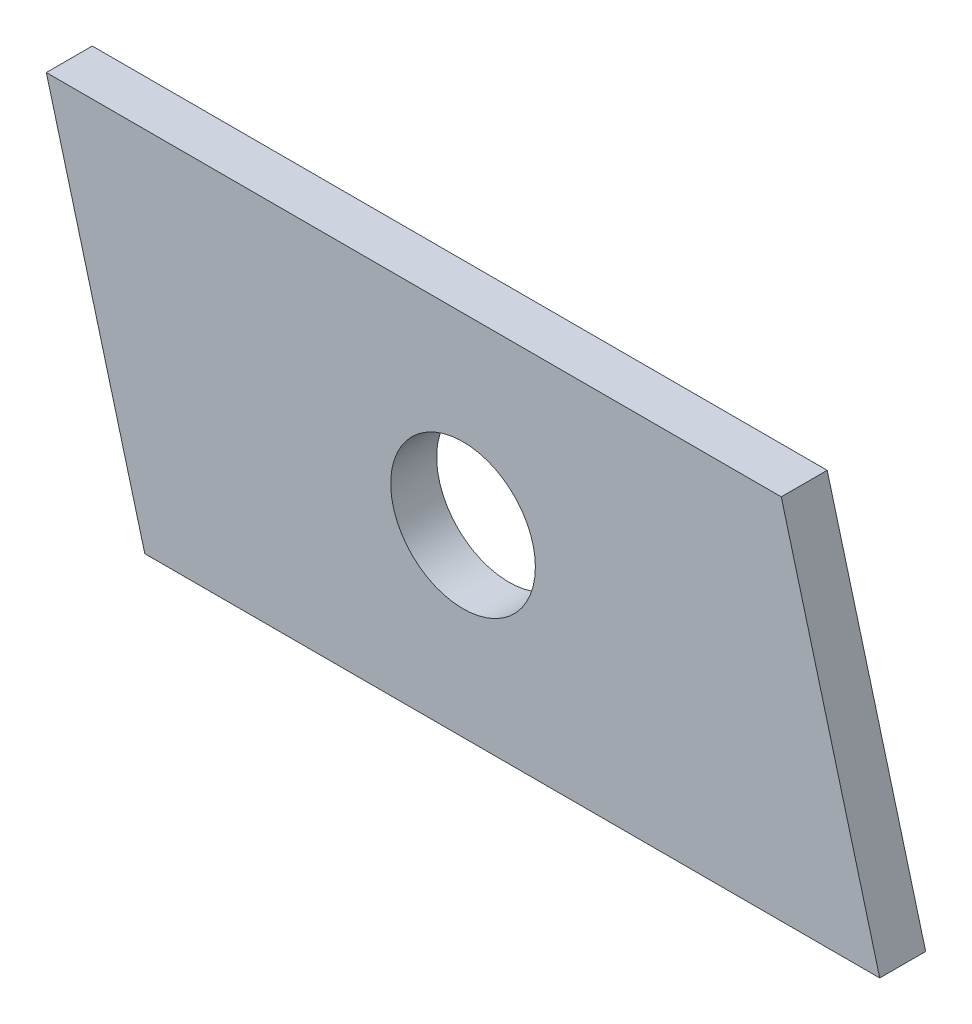
ISO-10303-21;
HEADER;
FILE_DESCRIPTION(('STEP AP214'),'2;1');
FILE_NAME('part.step','',(''),(''),'','','');
FILE_SCHEMA(('AUTOMOTIVE_DESIGN { 1 0 10303 214 1 1 1 1 }'));
ENDSEC;
DATA;
#1=APPLICATION_CONTEXT('core data for automotive mechanical design processes');
#2=APPLICATION_PROTOCOL_DEFINITION('international standard','automotive_design',2000,#1);
#3=PRODUCT_CONTEXT('',#1,'mechanical');
#4=PRODUCT('Part','Part','',(#3));
#5=PRODUCT_RELATED_PRODUCT_CATEGORY('part','',(#4));
#6=PRODUCT_DEFINITION_FORMATION('','',#4);
#7=PRODUCT_DEFINITION_CONTEXT('part definition',#1,'design');
#8=PRODUCT_DEFINITION('design','',#6,#7);
#9=PRODUCT_DEFINITION_SHAPE('','',#8);
#10=(LENGTH_UNIT() NAMED_UNIT(*) SI_UNIT(.MILLI.,.METRE.));
#11=(NAMED_UNIT(*) PLANE_ANGLE_UNIT() SI_UNIT($,.RADIAN.));
#12=(NAMED_UNIT(*) SI_UNIT($,.STERADIAN.) SOLID_ANGLE_UNIT());
#13=UNCERTAINTY_MEASURE_WITH_UNIT(LENGTH_MEASURE(1.E-05),#10,'distance_accuracy_value','');
#14=(GEOMETRIC_REPRESENTATION_CONTEXT(3) GLOBAL_UNCERTAINTY_ASSIGNED_CONTEXT((#13)) GLOBAL_UNIT_ASSIGNED_CONTEXT((#10,
#11,#12)) REPRESENTATION_CONTEXT('',''));
#15=CARTESIAN_POINT('',(0.,0.,0.));
#16=DIRECTION('',(0.,0.,1.));
#17=DIRECTION('',(1.,0.,0.));
#18=AXIS2_PLACEMENT_3D('',#15,#16,#17);
#19=CARTESIAN_POINT('',(-167.906905039941,117.173081746485,-3.175));
#20=DIRECTION('',(0.,1.,0.));
#21=DIRECTION('',(0.,0.,1.));
#22=AXIS2_PLACEMENT_3D('',#19,#20,#21);
#23=PLANE('',#22);
#24=DIRECTION('',(-1.,0.,0.));
#25=VECTOR('',#24,1.);
#26=CARTESIAN_POINT('',(-167.906905039941,117.173081746485,0.));
#27=LINE('',#26,#25);
#28=CARTESIAN_POINT('',(-167.906905039941,117.173081746485,0.));
#29=VERTEX_POINT('',#28);
#30=CARTESIAN_POINT('',(-218.706905039941,117.173081746485,0.));
#31=VERTEX_POINT('',#30);
#32=EDGE_CURVE('E117',#29,#31,#27,.T.);
#33=ORIENTED_EDGE('',*,*,#32,.F.);
#34=DIRECTION('',(0.,0.,1.));
#35=VECTOR('',#34,1.);
#36=CARTESIAN_POINT('',(-167.906905039941,117.173081746485,-3.175));
#37=LINE('',#36,#35);
#38=CARTESIAN_POINT('',(-167.906905039941,117.173081746485,-3.175));
#39=VERTEX_POINT('',#38);
#40=EDGE_CURVE('E11',#39,#29,#37,.T.);
#41=ORIENTED_EDGE('',*,*,#40,.F.);
#42=DIRECTION('',(-1.,0.,0.));
#43=VECTOR('',#42,1.);
#44=CARTESIAN_POINT('',(-167.906905039941,117.173081746485,-3.175));
#45=LINE('',#44,#43);
#46=CARTESIAN_POINT('',(-218.706905039941,117.173081746485,-3.175));
#47=VERTEX_POINT('',#46);
#48=EDGE_CURVE('E107',#39,#47,#45,.T.);
#49=ORIENTED_EDGE('',*,*,#48,.T.);
#50=DIRECTION('',(0.,0.,1.));
#51=VECTOR('',#50,1.);
#52=CARTESIAN_POINT('',(-218.706905039941,117.173081746485,-3.175));
#53=LINE('',#52,#51);
#54=EDGE_CURVE('E48',#47,#31,#53,.T.);
#55=ORIENTED_EDGE('',*,*,#54,.T.);
#56=EDGE_LOOP('',(#33,#41,#49,#55));
#57=FACE_BOUND('',#56,.T.);
#58=ADVANCED_FACE('F45',(#57),#23,.T.);
#59=CARTESIAN_POINT('',(-167.906905039941,117.173081746485,-3.175));
#60=DIRECTION('',(0.965925826289069,0.258819045102518,0.));
#61=DIRECTION('',(-0.258819045102518,0.965925826289069,0.));
#62=AXIS2_PLACEMENT_3D('',#59,#60,#61);
#63=PLANE('',#62);
#64=DIRECTION('',(-0.258819045102518,0.965925826289069,0.));
#65=VECTOR('',#64,1.);
#66=CARTESIAN_POINT('',(-167.906905039941,117.173081746485,0.));
#67=LINE('',#66,#65);
#68=CARTESIAN_POINT('',(-161.10099555219,91.7730817464852,0.));
#69=VERTEX_POINT('',#68);
#70=EDGE_CURVE('E111',#69,#29,#67,.T.);
#71=ORIENTED_EDGE('',*,*,#70,.F.);
#72=DIRECTION('',(0.,0.,1.));
#73=VECTOR('',#72,1.);
#74=CARTESIAN_POINT('',(-161.10099555219,91.7730817464852,-3.175));
#75=LINE('',#74,#73);
#76=CARTESIAN_POINT('',(-161.10099555219,91.7730817464852,-3.175));
#77=VERTEX_POINT('',#76);
#78=EDGE_CURVE('E55',#77,#69,#75,.T.);
#79=ORIENTED_EDGE('',*,*,#78,.F.);
#80=DIRECTION('',(-0.258819045102518,0.965925826289069,0.));
#81=VECTOR('',#80,1.);
#82=CARTESIAN_POINT('',(-167.906905039941,117.173081746485,-3.175));
#83=LINE('',#82,#81);
#84=EDGE_CURVE('E102',#77,#39,#83,.T.);
#85=ORIENTED_EDGE('',*,*,#84,.T.);
#86=ORIENTED_EDGE('',*,*,#40,.T.);
#87=EDGE_LOOP('',(#71,#79,#85,#86));
#88=FACE_BOUND('',#87,.T.);
#89=ADVANCED_FACE('F172',(#88),#63,.T.);
#90=CARTESIAN_POINT('',(-211.90099555219,91.7730817464852,-3.175));
#91=DIRECTION('',(0.,-1.,0.));
#92=DIRECTION('',(0.,0.,-1.));
#93=AXIS2_PLACEMENT_3D('',#90,#91,#92);
#94=PLANE('',#93);
#95=DIRECTION('',(1.,0.,0.));
#96=VECTOR('',#95,1.);
#97=CARTESIAN_POINT('',(-211.90099555219,91.7730817464852,0.));
#98=LINE('',#97,#96);
#99=CARTESIAN_POINT('',(-211.90099555219,91.7730817464852,0.));
#100=VERTEX_POINT('',#99);
#101=EDGE_CURVE('E96',#100,#69,#98,.T.);
#102=ORIENTED_EDGE('',*,*,#101,.F.);
#103=DIRECTION('',(0.,0.,1.));
#104=VECTOR('',#103,1.);
#105=CARTESIAN_POINT('',(-211.90099555219,91.7730817464852,-3.175));
#106=LINE('',#105,#104);
#107=CARTESIAN_POINT('',(-211.90099555219,91.7730817464852,-3.175));
#108=VERTEX_POINT('',#107);
#109=EDGE_CURVE('E91',#108,#100,#106,.T.);
#110=ORIENTED_EDGE('',*,*,#109,.F.);
#111=DIRECTION('',(1.,0.,0.));
#112=VECTOR('',#111,1.);
#113=CARTESIAN_POINT('',(-211.90099555219,91.7730817464852,-3.175));
#114=LINE('',#113,#112);
#115=EDGE_CURVE('E94',#108,#77,#114,.T.);
#116=ORIENTED_EDGE('',*,*,#115,.T.);
#117=ORIENTED_EDGE('',*,*,#78,.T.);
#118=EDGE_LOOP('',(#102,#110,#116,#117));
#119=FACE_BOUND('',#118,.T.);
#120=ADVANCED_FACE('F93',(#119),#94,.T.);
#121=CARTESIAN_POINT('',(-218.706905039941,117.173081746485,-3.175));
#122=DIRECTION('',(-0.965925826289069,-0.258819045102518,0.));
#123=DIRECTION('',(0.258819045102518,-0.965925826289069,0.));
#124=AXIS2_PLACEMENT_3D('',#121,#122,#123);
#125=PLANE('',#124);
#126=DIRECTION('',(0.258819045102518,-0.965925826289069,0.));
#127=VECTOR('',#126,1.);
#128=CARTESIAN_POINT('',(-218.706905039941,117.173081746485,0.));
#129=LINE('',#128,#127);
#130=EDGE_CURVE('E121',#31,#100,#129,.T.);
#131=ORIENTED_EDGE('',*,*,#130,.F.);
#132=ORIENTED_EDGE('',*,*,#54,.F.);
#133=DIRECTION('',(0.258819045102518,-0.965925826289069,0.));
#134=VECTOR('',#133,1.);
#135=CARTESIAN_POINT('',(-218.706905039941,117.173081746485,-3.175));
#136=LINE('',#135,#134);
#137=EDGE_CURVE('E101',#47,#108,#136,.T.);
#138=ORIENTED_EDGE('',*,*,#137,.T.);
#139=ORIENTED_EDGE('',*,*,#109,.T.);
#140=EDGE_LOOP('',(#131,#132,#138,#139));
#141=FACE_BOUND('',#140,.T.);
#142=ADVANCED_FACE('F105',(#141),#125,.T.);
#143=CARTESIAN_POINT('',(0.,0.,-3.175));
#144=DIRECTION('',(0.,0.,1.));
#145=DIRECTION('',(1.,0.,0.));
#146=AXIS2_PLACEMENT_3D('',#143,#144,#145);
#147=PLANE('',#146);
#148=CARTESIAN_POINT('',(-189.903950296066,104.473081746485,-3.175));
#149=DIRECTION('',(0.,0.,1.));
#150=DIRECTION('',(1.,0.,0.));
#151=AXIS2_PLACEMENT_3D('',#148,#149,#150);
#152=CIRCLE('',#151,4.99999999999999);
#153=CARTESIAN_POINT('',(-184.903950296066,104.473081746485,-3.175));
#154=VERTEX_POINT('',#153);
#155=EDGE_CURVE('E122',#154,#154,#152,.T.);
#156=ORIENTED_EDGE('',*,*,#155,.T.);
#157=EDGE_LOOP('',(#156));
#158=FACE_BOUND('',#157,.T.);
#159=ORIENTED_EDGE('',*,*,#48,.F.);
#160=ORIENTED_EDGE('',*,*,#84,.F.);
#161=ORIENTED_EDGE('',*,*,#115,.F.);
#162=ORIENTED_EDGE('',*,*,#137,.F.);
#163=EDGE_LOOP('',(#159,#160,#161,#162));
#164=FACE_BOUND('',#163,.T.);
#165=ADVANCED_FACE('F100',(#158,#164),#147,.F.);
#166=CARTESIAN_POINT('',(0.,0.,0.));
#167=DIRECTION('',(0.,0.,1.));
#168=DIRECTION('',(1.,0.,0.));
#169=AXIS2_PLACEMENT_3D('',#166,#167,#168);
#170=PLANE('',#169);
#171=CARTESIAN_POINT('',(-189.903950296066,104.473081746485,0.));
#172=DIRECTION('',(0.,0.,1.));
#173=DIRECTION('',(1.,0.,0.));
#174=AXIS2_PLACEMENT_3D('',#171,#172,#173);
#175=CIRCLE('',#174,4.99999999999999);
#176=CARTESIAN_POINT('',(-184.903950296066,104.473081746485,0.));
#177=VERTEX_POINT('',#176);
#178=EDGE_CURVE('E159',#177,#177,#175,.T.);
#179=ORIENTED_EDGE('',*,*,#178,.F.);
#180=EDGE_LOOP('',(#179));
#181=FACE_BOUND('',#180,.T.);
#182=ORIENTED_EDGE('',*,*,#32,.T.);
#183=ORIENTED_EDGE('',*,*,#130,.T.);
#184=ORIENTED_EDGE('',*,*,#101,.T.);
#185=ORIENTED_EDGE('',*,*,#70,.T.);
#186=EDGE_LOOP('',(#182,#183,#184,#185));
#187=FACE_BOUND('',#186,.T.);
#188=ADVANCED_FACE('F168',(#181,#187),#170,.T.);
#189=CARTESIAN_POINT('',(-189.903950296066,104.473081746485,-3.175));
#190=DIRECTION('',(0.,0.,1.));
#191=DIRECTION('',(1.,0.,0.));
#192=AXIS2_PLACEMENT_3D('',#189,#190,#191);
#193=CYLINDRICAL_SURFACE('',#192,4.99999999999999);
#194=ORIENTED_EDGE('',*,*,#155,.F.);
#195=EDGE_LOOP('',(#194));
#196=FACE_BOUND('',#195,.T.);
#197=ORIENTED_EDGE('',*,*,#178,.T.);
#198=EDGE_LOOP('',(#197));
#199=FACE_BOUND('',#198,.T.);
#200=ADVANCED_FACE('F166',(#196,#199),#193,.F.);
#201=CLOSED_SHELL('',(#58,#89,#120,#142,#165,#188,#200));
#202=MANIFOLD_SOLID_BREP('B2',#201);
#203=ADVANCED_BREP_SHAPE_REPRESENTATION('',(#18,#202),#14);
#204=SHAPE_DEFINITION_REPRESENTATION(#9,#203);
ENDSEC;
END-ISO-10303-21;
